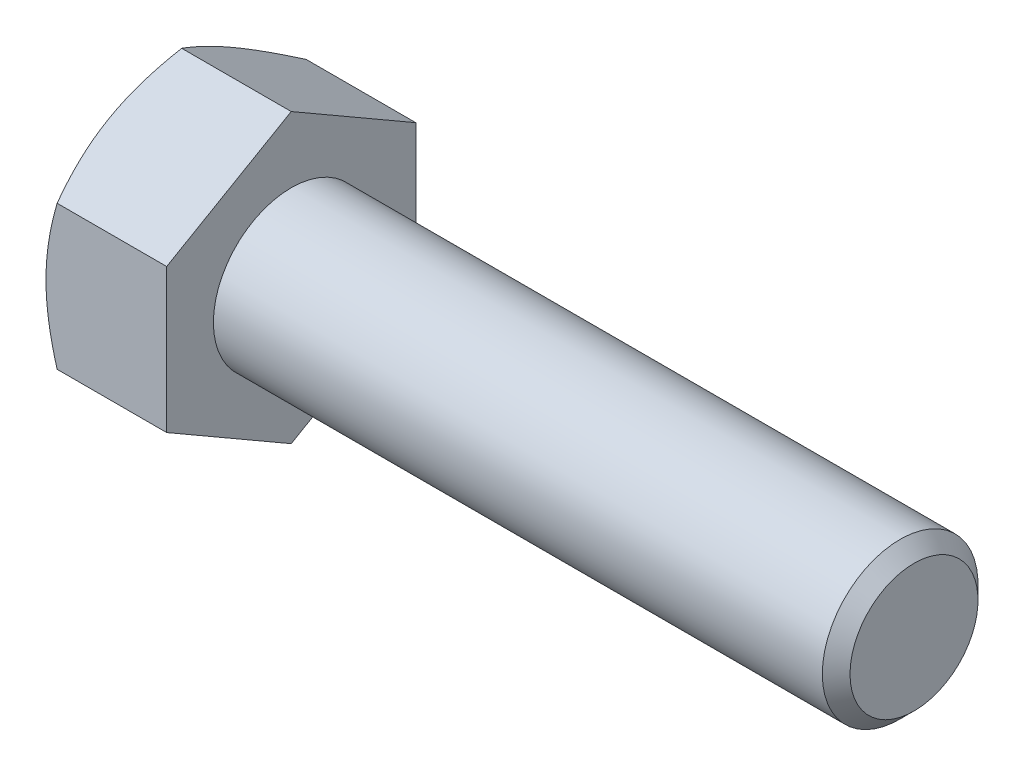
ISO-10303-21;
HEADER;
FILE_DESCRIPTION(('STEP AP214'),'2;1');
FILE_NAME('part.step','',(''),(''),'','','');
FILE_SCHEMA(('AUTOMOTIVE_DESIGN { 1 0 10303 214 1 1 1 1 }'));
ENDSEC;
DATA;
#1=APPLICATION_CONTEXT('core data for automotive mechanical design processes');
#2=APPLICATION_PROTOCOL_DEFINITION('international standard','automotive_design',2000,#1);
#3=PRODUCT_CONTEXT('',#1,'mechanical');
#4=PRODUCT('Part','Part','',(#3));
#5=PRODUCT_RELATED_PRODUCT_CATEGORY('part','',(#4));
#6=PRODUCT_DEFINITION_FORMATION('','',#4);
#7=PRODUCT_DEFINITION_CONTEXT('part definition',#1,'design');
#8=PRODUCT_DEFINITION('design','',#6,#7);
#9=PRODUCT_DEFINITION_SHAPE('','',#8);
#10=(LENGTH_UNIT() NAMED_UNIT(*) SI_UNIT(.MILLI.,.METRE.));
#11=(NAMED_UNIT(*) PLANE_ANGLE_UNIT() SI_UNIT($,.RADIAN.));
#12=(NAMED_UNIT(*) SI_UNIT($,.STERADIAN.) SOLID_ANGLE_UNIT());
#13=UNCERTAINTY_MEASURE_WITH_UNIT(LENGTH_MEASURE(1.E-05),#10,'distance_accuracy_value','');
#14=(GEOMETRIC_REPRESENTATION_CONTEXT(3) GLOBAL_UNCERTAINTY_ASSIGNED_CONTEXT((#13)) GLOBAL_UNIT_ASSIGNED_CONTEXT((#10,
#11,#12)) REPRESENTATION_CONTEXT('',''));
#15=CARTESIAN_POINT('',(0.,0.,0.));
#16=DIRECTION('',(0.,0.,1.));
#17=DIRECTION('',(1.,0.,0.));
#18=AXIS2_PLACEMENT_3D('',#15,#16,#17);
#19=CARTESIAN_POINT('',(3.875,2.3094010767585,-4.));
#20=DIRECTION('',(0.,-0.866025403784438,0.500000000000001));
#21=DIRECTION('',(0.,-0.500000000000001,-0.866025403784438));
#22=AXIS2_PLACEMENT_3D('',#19,#20,#21);
#23=PLANE('',#22);
#24=CARTESIAN_POINT('',(0.357332259074766,4.61891762357085,0.0002));
#25=CARTESIAN_POINT('',(0.298717873648282,4.51743148381381,-0.175579150323228));
#26=CARTESIAN_POINT('',(0.245410321462263,4.41506932144052,-0.35287561632638));
#27=CARTESIAN_POINT('',(0.152361670746404,4.2085725054774,-0.710538593175706));
#28=CARTESIAN_POINT('',(0.112653489029705,4.10443418285647,-0.89091145897015));
#29=CARTESIAN_POINT('',(0.05084221528028,3.89744813015756,-1.24942181870279));
#30=CARTESIAN_POINT('',(0.0283277315228896,3.7946322465506,-1.42750415293514));
#31=CARTESIAN_POINT('',(0.00145062314658241,3.58851671999023,-1.78450671716651));
#32=CARTESIAN_POINT('',(-0.00293425857305617,3.48521782616117,-1.9634256496441));
#33=CARTESIAN_POINT('',(0.0061900729399703,3.29219970504619,-2.29774284219673));
#34=CARTESIAN_POINT('',(0.0174589539879938,3.20245157692487,-2.45319115998706));
#35=CARTESIAN_POINT('',(0.0531739907981921,3.02354002635497,-2.76307505563505));
#36=CARTESIAN_POINT('',(0.0776323457115318,2.93437722268073,-2.91750956174413));
#37=CARTESIAN_POINT('',(0.138776064919287,2.75509682012354,-3.22803232777458));
#38=CARTESIAN_POINT('',(0.175720603654861,2.6650019108942,-3.3840812880631));
#39=CARTESIAN_POINT('',(0.259570072548023,2.486155802,-3.69385183540384));
#40=CARTESIAN_POINT('',(0.306455302212736,2.39740231122585,-3.84757739077378));
#41=CARTESIAN_POINT('',(0.357332259074762,2.30928560670466,-4.0002));
#42=B_SPLINE_CURVE_WITH_KNOTS('',3,(#24,#25,#26,#27,#28,#29,#30,#31,#32,#33,#34,#35,#36,#37,#38,
#39,#40,#41),.UNSPECIFIED.,.F.,.F.,(4,2,2,2,2,2,2,2,4),(0.,0.634047835695966,1.26961969224543,
1.88946157213122,2.50854226669297,3.04757825393386,3.58711366126903,4.13861653143764,
4.68903648037743),.UNSPECIFIED.);
#43=CARTESIAN_POINT('',(0.357265589908162,4.61880215351701,0.));
#44=VERTEX_POINT('',#43);
#45=CARTESIAN_POINT('',(0.,3.46410161513775,-2.));
#46=VERTEX_POINT('',#45);
#47=EDGE_CURVE('E55',#44,#46,#42,.T.);
#48=ORIENTED_EDGE('',*,*,#47,.F.);
#49=DIRECTION('',(-1.,0.,0.));
#50=VECTOR('',#49,1.);
#51=CARTESIAN_POINT('',(3.875,4.61880215351701,0.));
#52=LINE('',#51,#50);
#53=CARTESIAN_POINT('',(3.875,4.61880215351701,0.));
#54=VERTEX_POINT('',#53);
#55=EDGE_CURVE('E151',#54,#44,#52,.T.);
#56=ORIENTED_EDGE('',*,*,#55,.F.);
#57=DIRECTION('',(0.,0.500000000000001,0.866025403784438));
#58=VECTOR('',#57,1.);
#59=CARTESIAN_POINT('',(3.875,2.3094010767585,-4.));
#60=LINE('',#59,#58);
#61=CARTESIAN_POINT('',(3.875,2.3094010767585,-4.));
#62=VERTEX_POINT('',#61);
#63=EDGE_CURVE('E236',#62,#54,#60,.T.);
#64=ORIENTED_EDGE('',*,*,#63,.F.);
#65=DIRECTION('',(-1.,0.,0.));
#66=VECTOR('',#65,1.);
#67=CARTESIAN_POINT('',(3.875,2.3094010767585,-4.));
#68=LINE('',#67,#66);
#69=CARTESIAN_POINT('',(0.357265589908158,2.3094010767585,-4.));
#70=VERTEX_POINT('',#69);
#71=EDGE_CURVE('E139',#62,#70,#68,.T.);
#72=ORIENTED_EDGE('',*,*,#71,.T.);
#73=EDGE_CURVE('E133',#46,#70,#42,.T.);
#74=ORIENTED_EDGE('',*,*,#73,.F.);
#75=EDGE_LOOP('',(#48,#56,#64,#72,#74));
#76=FACE_BOUND('',#75,.T.);
#77=ADVANCED_FACE('F39',(#76),#23,.F.);
#78=CARTESIAN_POINT('',(3.875,4.61880215351701,0.));
#79=DIRECTION('',(0.,-0.866025403784438,-0.500000000000001));
#80=DIRECTION('',(0.,0.500000000000001,-0.866025403784438));
#81=AXIS2_PLACEMENT_3D('',#78,#79,#80);
#82=PLANE('',#81);
#83=CARTESIAN_POINT('',(0.357332259074763,2.30928560670466,4.0002));
#84=CARTESIAN_POINT('',(0.298717873648279,2.4107717464617,3.82442084967677));
#85=CARTESIAN_POINT('',(0.24541032146226,2.51313390883499,3.64712438367362));
#86=CARTESIAN_POINT('',(0.152361670746402,2.71963072479811,3.28946140682429));
#87=CARTESIAN_POINT('',(0.112653489029703,2.82376904741904,3.10908854102985));
#88=CARTESIAN_POINT('',(0.0508422152802788,3.03075510011795,2.75057818129721));
#89=CARTESIAN_POINT('',(0.028327731522889,3.13357098372492,2.57249584706486));
#90=CARTESIAN_POINT('',(0.00145062314658226,3.33968651028528,2.21549328283349));
#91=CARTESIAN_POINT('',(-0.00293425857305652,3.44298540411434,2.0365743503559));
#92=CARTESIAN_POINT('',(0.00619007293997049,3.63600352522932,1.70225715780327));
#93=CARTESIAN_POINT('',(0.0174589539879946,3.72575165335065,1.54680884001294));
#94=CARTESIAN_POINT('',(0.0531739907981937,3.90466320392055,1.23692494436495));
#95=CARTESIAN_POINT('',(0.0776323457115336,3.99382600759479,1.08249043825587));
#96=CARTESIAN_POINT('',(0.138776064919289,4.17310641015197,0.771967672225423));
#97=CARTESIAN_POINT('',(0.175720603654863,4.26320131938131,0.615918711936899));
#98=CARTESIAN_POINT('',(0.259570072548026,4.44204742827551,0.306148164596161));
#99=CARTESIAN_POINT('',(0.306455302212739,4.53080091904967,0.152422609226221));
#100=CARTESIAN_POINT('',(0.357332259074766,4.61891762357085,-0.000199999999999917));
#101=B_SPLINE_CURVE_WITH_KNOTS('',3,(#83,#84,#85,#86,#87,#88,#89,#90,#91,#92,#93,#94,#95,#96,
#97,#98,#99,#100),.UNSPECIFIED.,.F.,.F.,(4,2,2,2,2,2,2,2,4),(0.,0.634047835695965,
1.26961969224543,1.88946157213122,2.50854226669297,3.04757825393385,3.58711366126903,
4.13861653143764,4.68903648037743),.UNSPECIFIED.);
#102=CARTESIAN_POINT('',(0.357265589908158,2.3094010767585,4.));
#103=VERTEX_POINT('',#102);
#104=CARTESIAN_POINT('',(0.,3.46410161513775,2.));
#105=VERTEX_POINT('',#104);
#106=EDGE_CURVE('E62',#103,#105,#101,.T.);
#107=ORIENTED_EDGE('',*,*,#106,.F.);
#108=DIRECTION('',(-1.,0.,0.));
#109=VECTOR('',#108,1.);
#110=CARTESIAN_POINT('',(3.875,2.3094010767585,4.));
#111=LINE('',#110,#109);
#112=CARTESIAN_POINT('',(3.875,2.3094010767585,4.));
#113=VERTEX_POINT('',#112);
#114=EDGE_CURVE('E149',#113,#103,#111,.T.);
#115=ORIENTED_EDGE('',*,*,#114,.F.);
#116=DIRECTION('',(0.,-0.500000000000001,0.866025403784438));
#117=VECTOR('',#116,1.);
#118=CARTESIAN_POINT('',(3.875,4.61880215351701,0.));
#119=LINE('',#118,#117);
#120=EDGE_CURVE('E234',#54,#113,#119,.T.);
#121=ORIENTED_EDGE('',*,*,#120,.F.);
#122=ORIENTED_EDGE('',*,*,#55,.T.);
#123=EDGE_CURVE('E166',#105,#44,#101,.T.);
#124=ORIENTED_EDGE('',*,*,#123,.F.);
#125=EDGE_LOOP('',(#107,#115,#121,#122,#124));
#126=FACE_BOUND('',#125,.T.);
#127=ADVANCED_FACE('F172',(#126),#82,.F.);
#128=CARTESIAN_POINT('',(3.875,2.3094010767585,4.));
#129=DIRECTION('',(0.,0.,-1.));
#130=DIRECTION('',(-1.,0.,0.));
#131=AXIS2_PLACEMENT_3D('',#128,#129,#130);
#132=PLANE('',#131);
#133=CARTESIAN_POINT('',(2.00011120385046,-6.30203842341183,4.));
#134=CARTESIAN_POINT('',(1.91454696302706,-6.12645846502785,4.));
#135=CARTESIAN_POINT('',(1.82977515690346,-5.95048585438817,4.));
#136=CARTESIAN_POINT('',(1.66226027661303,-5.59754684141581,4.));
#137=CARTESIAN_POINT('',(1.57951750403356,-5.42058029609575,4.));
#138=CARTESIAN_POINT('',(1.4161092617051,-5.06457985037648,4.));
#139=CARTESIAN_POINT('',(1.33545672605323,-4.8855399932704,4.));
#140=CARTESIAN_POINT('',(1.17732357965482,-4.52607013031638,4.));
#141=CARTESIAN_POINT('',(1.09984282527701,-4.34564018785784,4.));
#142=CARTESIAN_POINT('',(0.946328317401932,-3.97695712218343,4.));
#143=CARTESIAN_POINT('',(0.870432703669638,-3.78864617451164,4.));
#144=CARTESIAN_POINT('',(0.724150215280467,-3.40985798807121,4.));
#145=CARTESIAN_POINT('',(0.653763944661546,-3.21938051438197,4.));
#146=CARTESIAN_POINT('',(0.520275623047367,-2.83628176991273,4.));
#147=CARTESIAN_POINT('',(0.457159650991073,-2.64366539743606,4.));
#148=CARTESIAN_POINT('',(0.340171517307156,-2.25567134243403,4.));
#149=CARTESIAN_POINT('',(0.286296547451804,-2.06029451838051,4.));
#150=CARTESIAN_POINT('',(0.190596079734457,-1.66775019550379,4.));
#151=CARTESIAN_POINT('',(0.148703055513722,-1.4705994608802,4.));
#152=CARTESIAN_POINT('',(0.0792701946386919,-1.07374632394227,4.));
#153=CARTESIAN_POINT('',(0.0517287926791975,-0.874044202338206,4.));
#154=CARTESIAN_POINT('',(0.0135517370726279,-0.475733693101286,4.));
#155=CARTESIAN_POINT('',(0.00269106574828969,-0.277147419592185,4.));
#156=CARTESIAN_POINT('',(-0.00180277188208267,0.120241435280096,4.));
#157=CARTESIAN_POINT('',(0.00456430925773771,0.3190440197092,4.));
#158=CARTESIAN_POINT('',(0.0293199840216136,0.653649130511195,4.));
#159=CARTESIAN_POINT('',(0.0433487693682717,0.789796203877397,4.));
#160=CARTESIAN_POINT('',(0.0786650583146093,1.06115179654902,4.));
#161=CARTESIAN_POINT('',(0.0999534649347829,1.19636019695747,4.));
#162=CARTESIAN_POINT('',(0.173595112588807,1.60036108675971,4.));
#163=CARTESIAN_POINT('',(0.235713609104602,1.86739657992387,4.));
#164=CARTESIAN_POINT('',(0.344187906710575,2.26690842076046,4.));
#165=CARTESIAN_POINT('',(0.383434483337921,2.40143348236976,4.));
#166=CARTESIAN_POINT('',(0.466191101497678,2.66917849144139,4.));
#167=CARTESIAN_POINT('',(0.509701176020062,2.8023984287962,4.));
#168=CARTESIAN_POINT('',(0.600271093153284,3.06757339019427,4.));
#169=CARTESIAN_POINT('',(0.647329942526204,3.1995287566004,4.));
#170=CARTESIAN_POINT('',(0.744425095187852,3.46233233841869,4.));
#171=CARTESIAN_POINT('',(0.79446132942051,3.59318057942867,4.));
#172=CARTESIAN_POINT('',(0.933355738336687,3.94627302000953,4.));
#173=CARTESIAN_POINT('',(1.02459875944488,4.16757823468636,4.));
#174=CARTESIAN_POINT('',(1.21247228327858,4.6078984954445,4.));
#175=CARTESIAN_POINT('',(1.30910339202328,4.82691328060904,4.));
#176=CARTESIAN_POINT('',(1.50647026541792,5.26317250155479,4.));
#177=CARTESIAN_POINT('',(1.60720746834516,5.48041628445574,4.));
#178=CARTESIAN_POINT('',(1.81181128465854,5.91342831583172,4.));
#179=CARTESIAN_POINT('',(1.91567799508361,6.12919651829727,4.));
#180=CARTESIAN_POINT('',(2.12601768874589,6.5598802172624,4.));
#181=CARTESIAN_POINT('',(2.23249454398486,6.77479381881756,4.));
#182=CARTESIAN_POINT('',(2.44739203587053,7.20364802853136,4.));
#183=CARTESIAN_POINT('',(2.55581269331614,7.417588626248,4.));
#184=CARTESIAN_POINT('',(2.88334503455633,8.05812603320375,4.));
#185=CARTESIAN_POINT('',(3.1047754932341,8.48353660300325,4.));
#186=CARTESIAN_POINT('',(3.52798949335261,9.28704830216623,4.));
#187=CARTESIAN_POINT('',(3.72935795048664,9.66536912757715,4.));
#188=CARTESIAN_POINT('',(4.13451859162102,10.4207405569166,4.));
#189=CARTESIAN_POINT('',(4.33831092670877,10.7977910797637,4.));
#190=CARTESIAN_POINT('',(4.74699525515909,11.5496417866802,4.));
#191=CARTESIAN_POINT('',(4.95188119224404,11.9244452679585,4.));
#192=CARTESIAN_POINT('',(5.36302659523091,12.673259459655,4.));
#193=CARTESIAN_POINT('',(5.56928595009503,13.0472702310149,4.));
#194=CARTESIAN_POINT('',(5.77604503303503,13.4210028084018,4.));
#195=B_SPLINE_CURVE_WITH_KNOTS('',3,(#133,#134,#135,#136,#137,#138,#139,#140,#141,#142,#143,
#144,#145,#146,#147,#148,#149,#150,#151,#152,#153,#154,#155,#156,#157,#158,#159,#160,#161,#162,
#163,#164,#165,#166,#167,#168,#169,#170,#171,#172,#173,#174,#175,#176,#177,#178,#179,#180,#181,
#182,#183,#184,#185,#186,#187,#188,#189,#190,#191,#192,#193,#194),.UNSPECIFIED.,.F.,.F.,(4,2,2,
2,2,2,2,2,2,2,2,2,2,2,2,2,2,2,2,2,2,2,2,2,2,2,2,2,2,2,4),(0.,0.585964079589229,1.1720147329867,
1.76109183439221,2.35014223039207,2.95916537113302,3.56825519120251,4.17615863495933,
4.78387701573011,5.38809978568041,5.99225664035711,6.58818972380393,7.18413136680919,
7.59453802315343,8.00499574839967,8.82630883348707,9.24666973074845,9.66703388092335,
10.0872808123363,10.5075180005349,11.2255416622244,11.9436462463738,12.6620045660407,
13.3803851833438,14.0999050636407,14.8194326474842,16.2581595478086,17.5438734370163,
18.8296678929704,20.1111105384062,21.3924508103747),.UNSPECIFIED.);
#196=CARTESIAN_POINT('',(0.35726558990816,-2.30940107675851,4.));
#197=VERTEX_POINT('',#196);
#198=CARTESIAN_POINT('',(0.,0.,4.));
#199=VERTEX_POINT('',#198);
#200=EDGE_CURVE('E246',#197,#199,#195,.T.);
#201=ORIENTED_EDGE('',*,*,#200,.F.);
#202=DIRECTION('',(-1.,0.,0.));
#203=VECTOR('',#202,1.);
#204=CARTESIAN_POINT('',(3.875,-2.30940107675851,4.));
#205=LINE('',#204,#203);
#206=CARTESIAN_POINT('',(3.875,-2.30940107675851,4.));
#207=VERTEX_POINT('',#206);
#208=EDGE_CURVE('E141',#207,#197,#205,.T.);
#209=ORIENTED_EDGE('',*,*,#208,.F.);
#210=DIRECTION('',(0.,-1.,0.));
#211=VECTOR('',#210,1.);
#212=CARTESIAN_POINT('',(3.875,2.3094010767585,4.));
#213=LINE('',#212,#211);
#214=EDGE_CURVE('E230',#113,#207,#213,.T.);
#215=ORIENTED_EDGE('',*,*,#214,.F.);
#216=ORIENTED_EDGE('',*,*,#114,.T.);
#217=EDGE_CURVE('E188',#199,#103,#195,.T.);
#218=ORIENTED_EDGE('',*,*,#217,.F.);
#219=EDGE_LOOP('',(#201,#209,#215,#216,#218));
#220=FACE_BOUND('',#219,.T.);
#221=ADVANCED_FACE('F252',(#220),#132,.F.);
#222=CARTESIAN_POINT('',(3.875,-4.61880215351702,0.));
#223=DIRECTION('',(0.,0.866025403784438,-0.500000000000001));
#224=DIRECTION('',(0.,0.500000000000001,0.866025403784438));
#225=AXIS2_PLACEMENT_3D('',#222,#223,#224);
#226=PLANE('',#225);
#227=CARTESIAN_POINT('',(0.357332259074769,-4.61891762357086,-0.000199999999999656));
#228=CARTESIAN_POINT('',(0.298717873648285,-4.51743148381382,0.175579150323229));
#229=CARTESIAN_POINT('',(0.245410321462266,-4.41506932144053,0.352875616326382));
#230=CARTESIAN_POINT('',(0.152361670746407,-4.2085725054774,0.710538593175707));
#231=CARTESIAN_POINT('',(0.112653489029708,-4.10443418285648,0.890911458970152));
#232=CARTESIAN_POINT('',(0.0508422152802828,-3.89744813015757,1.24942181870279));
#233=CARTESIAN_POINT('',(0.0283277315228926,-3.7946322465506,1.42750415293514));
#234=CARTESIAN_POINT('',(0.00145062314658542,-3.58851671999023,1.78450671716651));
#235=CARTESIAN_POINT('',(-0.00293425857305338,-3.48521782616118,1.9634256496441));
#236=CARTESIAN_POINT('',(0.00619007293997324,-3.29219970504619,2.29774284219673));
#237=CARTESIAN_POINT('',(0.017458953987997,-3.20245157692487,2.45319115998707));
#238=CARTESIAN_POINT('',(0.0531739907981951,-3.02354002635497,2.76307505563506));
#239=CARTESIAN_POINT('',(0.0776323457115345,-2.93437722268073,2.91750956174413));
#240=CARTESIAN_POINT('',(0.13877606491929,-2.75509682012355,3.22803232777458));
#241=CARTESIAN_POINT('',(0.175720603654863,-2.6650019108942,3.3840812880631));
#242=CARTESIAN_POINT('',(0.259570072548026,-2.48615580200001,3.69385183540384));
#243=CARTESIAN_POINT('',(0.306455302212738,-2.39740231122585,3.84757739077378));
#244=CARTESIAN_POINT('',(0.357332259074764,-2.30928560670467,4.0002));
#245=B_SPLINE_CURVE_WITH_KNOTS('',3,(#227,#228,#229,#230,#231,#232,#233,#234,#235,#236,#237,
#238,#239,#240,#241,#242,#243,#244),.UNSPECIFIED.,.F.,.F.,(4,2,2,2,2,2,2,2,4),(0.,
0.634047835695967,1.26961969224543,1.88946157213122,2.50854226669297,3.04757825393386,
3.58711366126904,4.13861653143764,4.68903648037743),.UNSPECIFIED.);
#246=CARTESIAN_POINT('',(0.357265589908165,-4.61880215351702,0.));
#247=VERTEX_POINT('',#246);
#248=CARTESIAN_POINT('',(0.,-3.46410161513775,2.));
#249=VERTEX_POINT('',#248);
#250=EDGE_CURVE('E174',#247,#249,#245,.T.);
#251=ORIENTED_EDGE('',*,*,#250,.F.);
#252=DIRECTION('',(-1.,0.,0.));
#253=VECTOR('',#252,1.);
#254=CARTESIAN_POINT('',(3.875,-4.61880215351702,0.));
#255=LINE('',#254,#253);
#256=CARTESIAN_POINT('',(3.875,-4.61880215351702,0.));
#257=VERTEX_POINT('',#256);
#258=EDGE_CURVE('E138',#257,#247,#255,.T.);
#259=ORIENTED_EDGE('',*,*,#258,.F.);
#260=DIRECTION('',(0.,-0.500000000000001,-0.866025403784438));
#261=VECTOR('',#260,1.);
#262=CARTESIAN_POINT('',(3.875,-4.61880215351702,0.));
#263=LINE('',#262,#261);
#264=EDGE_CURVE('E228',#207,#257,#263,.T.);
#265=ORIENTED_EDGE('',*,*,#264,.F.);
#266=ORIENTED_EDGE('',*,*,#208,.T.);
#267=EDGE_CURVE('E176',#249,#197,#245,.T.);
#268=ORIENTED_EDGE('',*,*,#267,.F.);
#269=EDGE_LOOP('',(#251,#259,#265,#266,#268));
#270=FACE_BOUND('',#269,.T.);
#271=ADVANCED_FACE('F224',(#270),#226,.F.);
#272=CARTESIAN_POINT('',(3.875,-2.30940107675851,-4.));
#273=DIRECTION('',(0.,0.866025403784438,0.500000000000001));
#274=DIRECTION('',(0.,-0.500000000000001,0.866025403784438));
#275=AXIS2_PLACEMENT_3D('',#272,#273,#274);
#276=PLANE('',#275);
#277=CARTESIAN_POINT('',(0.357332259074765,-2.30928560670467,-4.0002));
#278=CARTESIAN_POINT('',(0.298717873648281,-2.41077174646171,-3.82442084967677));
#279=CARTESIAN_POINT('',(0.245410321462262,-2.513133908835,-3.64712438367362));
#280=CARTESIAN_POINT('',(0.152361670746404,-2.71963072479812,-3.28946140682429));
#281=CARTESIAN_POINT('',(0.112653489029705,-2.82376904741905,-3.10908854102985));
#282=CARTESIAN_POINT('',(0.0508422152802814,-3.03075510011796,-2.75057818129721));
#283=CARTESIAN_POINT('',(0.0283277315228918,-3.13357098372492,-2.57249584706486));
#284=CARTESIAN_POINT('',(0.00145062314658541,-3.33968651028529,-2.21549328283349));
#285=CARTESIAN_POINT('',(-0.00293425857305316,-3.44298540411435,-2.0365743503559));
#286=CARTESIAN_POINT('',(0.006190072939974,-3.63600352522933,-1.70225715780327));
#287=CARTESIAN_POINT('',(0.0174589539879981,-3.72575165335065,-1.54680884001294));
#288=CARTESIAN_POINT('',(0.053173990798197,-3.90466320392055,-1.23692494436495));
#289=CARTESIAN_POINT('',(0.0776323457115368,-3.99382600759479,-1.08249043825587));
#290=CARTESIAN_POINT('',(0.138776064919293,-4.17310641015198,-0.771967672225423));
#291=CARTESIAN_POINT('',(0.175720603654867,-4.26320131938132,-0.615918711936898));
#292=CARTESIAN_POINT('',(0.25957007254803,-4.44204742827551,-0.306148164596161));
#293=CARTESIAN_POINT('',(0.306455302212742,-4.53080091904967,-0.152422609226221));
#294=CARTESIAN_POINT('',(0.357332259074769,-4.61891762357086,0.000200000000000066));
#295=B_SPLINE_CURVE_WITH_KNOTS('',3,(#277,#278,#279,#280,#281,#282,#283,#284,#285,#286,#287,
#288,#289,#290,#291,#292,#293,#294),.UNSPECIFIED.,.F.,.F.,(4,2,2,2,2,2,2,2,4),(0.,
0.634047835695965,1.26961969224543,1.88946157213122,2.50854226669297,3.04757825393386,
3.58711366126903,4.13861653143764,4.68903648037743),.UNSPECIFIED.);
#296=CARTESIAN_POINT('',(0.357265589908043,-2.30940107675869,-4.));
#297=VERTEX_POINT('',#296);
#298=CARTESIAN_POINT('',(0.,-3.46410161513775,-2.));
#299=VERTEX_POINT('',#298);
#300=EDGE_CURVE('E115',#297,#299,#295,.T.);
#301=ORIENTED_EDGE('',*,*,#300,.F.);
#302=DIRECTION('',(-1.,0.,0.));
#303=VECTOR('',#302,1.);
#304=CARTESIAN_POINT('',(3.875,-2.30940107675851,-4.));
#305=LINE('',#304,#303);
#306=CARTESIAN_POINT('',(3.875,-2.30940107675851,-4.));
#307=VERTEX_POINT('',#306);
#308=EDGE_CURVE('E129',#307,#297,#305,.T.);
#309=ORIENTED_EDGE('',*,*,#308,.F.);
#310=DIRECTION('',(0.,0.500000000000001,-0.866025403784438));
#311=VECTOR('',#310,1.);
#312=CARTESIAN_POINT('',(3.875,-2.30940107675851,-4.));
#313=LINE('',#312,#311);
#314=EDGE_CURVE('E226',#257,#307,#313,.T.);
#315=ORIENTED_EDGE('',*,*,#314,.F.);
#316=ORIENTED_EDGE('',*,*,#258,.T.);
#317=EDGE_CURVE('E132',#299,#247,#295,.T.);
#318=ORIENTED_EDGE('',*,*,#317,.F.);
#319=EDGE_LOOP('',(#301,#309,#315,#316,#318));
#320=FACE_BOUND('',#319,.T.);
#321=ADVANCED_FACE('F127',(#320),#276,.F.);
#322=CARTESIAN_POINT('',(3.875,2.3094010767585,-4.));
#323=DIRECTION('',(0.,0.,1.));
#324=DIRECTION('',(0.,-1.,0.));
#325=AXIS2_PLACEMENT_3D('',#322,#323,#324);
#326=PLANE('',#325);
#327=CARTESIAN_POINT('',(2.00011120589741,-6.30203842761113,-4.));
#328=CARTESIAN_POINT('',(1.91454696498874,-6.12645846908575,-4.));
#329=CARTESIAN_POINT('',(1.82977515877991,-5.95048585830456,-4.));
#330=CARTESIAN_POINT('',(1.66226027831944,-5.59754684504877,-4.));
#331=CARTESIAN_POINT('',(1.57951750565516,-5.42058029958678,-4.));
#332=CARTESIAN_POINT('',(1.41610926315703,-5.06457985358152,-4.));
#333=CARTESIAN_POINT('',(1.33545672742031,-4.88553999633137,-4.));
#334=CARTESIAN_POINT('',(1.17732358085362,-4.52607013308825,-4.));
#335=CARTESIAN_POINT('',(1.09984282639236,-4.34564019048468,-4.));
#336=CARTESIAN_POINT('',(0.946328318347809,-3.97695712450867,-4.));
#337=CARTESIAN_POINT('',(0.870432704529684,-3.78864617668021,-4.));
#338=CARTESIAN_POINT('',(0.724150215973384,-3.40985798992395,-4.));
#339=CARTESIAN_POINT('',(0.653763945273167,-3.21938051607555,-4.));
#340=CARTESIAN_POINT('',(0.520275623504079,-2.83628177128505,-4.));
#341=CARTESIAN_POINT('',(0.457159651374151,-2.64366539864628,-4.));
#342=CARTESIAN_POINT('',(0.340171517554839,-2.25567134331569,-4.));
#343=CARTESIAN_POINT('',(0.286296547637718,-2.0602945190957,-4.));
#344=CARTESIAN_POINT('',(0.190596079795568,-1.66775019580152,-4.));
#345=CARTESIAN_POINT('',(0.148703055516465,-1.47059946092579,-4.));
#346=CARTESIAN_POINT('',(0.0792701945625816,-1.0737463234774,-4.));
#347=CARTESIAN_POINT('',(0.0517287925825739,-0.874044201615014,-4.));
#348=CARTESIAN_POINT('',(0.0135517369810985,-0.475733691865667,-4.));
#349=CARTESIAN_POINT('',(0.00269106568150367,-0.277147418102514,-4.));
#350=CARTESIAN_POINT('',(-0.0018027718547366,0.120241437274119,-4.));
#351=CARTESIAN_POINT('',(0.00456430935448299,0.319044021953522,-4.));
#352=CARTESIAN_POINT('',(0.0293199842587319,0.653649133068289,-4.));
#353=CARTESIAN_POINT('',(0.0433487696608963,0.789796206499806,-4.));
#354=CARTESIAN_POINT('',(0.0786650587211739,1.06115179929909,-4.));
#355=CARTESIAN_POINT('',(0.0999534653997816,1.19636019976989,-4.));
#356=CARTESIAN_POINT('',(0.173595113230303,1.6003610897557,-4.));
#357=CARTESIAN_POINT('',(0.235713609865278,1.86739658303732,-4.));
#358=CARTESIAN_POINT('',(0.344187907647021,2.26690842404958,-4.));
#359=CARTESIAN_POINT('',(0.383434484333357,2.40143348571873,-4.));
#360=CARTESIAN_POINT('',(0.466191102609246,2.66917849490936,-4.));
#361=CARTESIAN_POINT('',(0.509701177188773,2.80239843232331,-4.));
#362=CARTESIAN_POINT('',(0.600271094434186,3.06757339383922,-4.));
#363=CARTESIAN_POINT('',(0.64732994386215,3.19952876030405,-4.));
#364=CARTESIAN_POINT('',(0.744425096631931,3.46233234223974,-4.));
#365=CARTESIAN_POINT('',(0.794461330917676,3.59318058330842,-4.));
#366=CARTESIAN_POINT('',(0.933355739925497,3.94627302392212,-4.));
#367=CARTESIAN_POINT('',(1.0245987610664,4.16757823857486,-4.));
#368=CARTESIAN_POINT('',(1.21247228495599,4.60789849928792,-4.));
#369=CARTESIAN_POINT('',(1.30910339372387,4.8269132844315,-4.));
#370=CARTESIAN_POINT('',(1.50647026715798,5.26317250533757,-4.));
#371=CARTESIAN_POINT('',(1.60720747010151,5.48041628821981,-4.));
#372=CARTESIAN_POINT('',(1.81181128644256,5.91342831956035,-4.));
#373=CARTESIAN_POINT('',(1.91567799687904,6.12919652200917,-4.));
#374=CARTESIAN_POINT('',(2.12601769056008,6.55988022094135,-4.));
#375=CARTESIAN_POINT('',(2.23249454580638,6.77479382248029,-4.));
#376=CARTESIAN_POINT('',(2.44739203770407,7.20364803216286,-4.));
#377=CARTESIAN_POINT('',(2.55581269515435,7.41758862986449,-4.));
#378=CARTESIAN_POINT('',(2.88334503640576,8.05812603677698,-4.));
#379=CARTESIAN_POINT('',(3.10477549508711,8.48353660654961,-4.));
#380=CARTESIAN_POINT('',(3.52798949521966,9.287048305686,-4.));
#381=CARTESIAN_POINT('',(3.7293579523648,9.66536913109687,-4.));
#382=CARTESIAN_POINT('',(4.13451859351913,10.4207405604373,-4.));
#383=CARTESIAN_POINT('',(4.33831092861572,10.7977910832854,-4.));
#384=CARTESIAN_POINT('',(4.74699525708426,11.5496417902084,-4.));
#385=CARTESIAN_POINT('',(4.9518811941786,11.9244452714923,-4.));
#386=CARTESIAN_POINT('',(5.36302659718324,12.6732594632006,-4.));
#387=CARTESIAN_POINT('',(5.56928595205573,13.0472702345667,-4.));
#388=CARTESIAN_POINT('',(5.77604503500377,13.42100281196,-4.));
#389=B_SPLINE_CURVE_WITH_KNOTS('',3,(#327,#328,#329,#330,#331,#332,#333,#334,#335,#336,#337,
#338,#339,#340,#341,#342,#343,#344,#345,#346,#347,#348,#349,#350,#351,#352,#353,#354,#355,#356,
#357,#358,#359,#360,#361,#362,#363,#364,#365,#366,#367,#368,#369,#370,#371,#372,#373,#374,#375,
#376,#377,#378,#379,#380,#381,#382,#383,#384,#385,#386,#387,#388),.UNSPECIFIED.,.F.,.F.,(4,2,2,
2,2,2,2,2,2,2,2,2,2,2,2,2,2,2,2,2,2,2,2,2,2,2,2,2,2,2,4),(0.,0.585964080082646,1.17201473397361,
1.76109183587772,2.35014223237614,2.95916537364923,3.56825519425103,4.17615863853846,
4.78387701983943,5.38809979056439,5.99225664601462,6.58818973021546,7.18413137397509,
7.59453803053127,8.00499575598947,8.82630884150174,9.24666973898511,9.667033889382,
10.0872808210163,10.5075180094363,11.2255416710968,11.9436462552169,12.6620045748536,
13.3803851921263,14.0999050723894,14.8194326561991,16.2581595564571,17.5438734456804,
18.8296679016496,20.1111105471137,21.3924508191106),.UNSPECIFIED.);
#390=CARTESIAN_POINT('',(0.,0.,-4.));
#391=VERTEX_POINT('',#390);
#392=EDGE_CURVE('E121',#70,#391,#389,.F.);
#393=ORIENTED_EDGE('',*,*,#392,.F.);
#394=ORIENTED_EDGE('',*,*,#71,.F.);
#395=DIRECTION('',(0.,1.,0.));
#396=VECTOR('',#395,1.);
#397=CARTESIAN_POINT('',(3.875,2.3094010767585,-4.));
#398=LINE('',#397,#396);
#399=EDGE_CURVE('E137',#307,#62,#398,.T.);
#400=ORIENTED_EDGE('',*,*,#399,.F.);
#401=ORIENTED_EDGE('',*,*,#308,.T.);
#402=EDGE_CURVE('E112',#391,#297,#389,.F.);
#403=ORIENTED_EDGE('',*,*,#402,.F.);
#404=EDGE_LOOP('',(#393,#394,#400,#401,#403));
#405=FACE_BOUND('',#404,.T.);
#406=ADVANCED_FACE('F135',(#405),#326,.F.);
#407=CARTESIAN_POINT('',(3.875,4.61880215351701,0.));
#408=DIRECTION('',(1.,0.,0.));
#409=DIRECTION('',(0.,0.,-1.));
#410=AXIS2_PLACEMENT_3D('',#407,#408,#409);
#411=PLANE('',#410);
#412=ORIENTED_EDGE('',*,*,#63,.T.);
#413=ORIENTED_EDGE('',*,*,#120,.T.);
#414=ORIENTED_EDGE('',*,*,#214,.T.);
#415=ORIENTED_EDGE('',*,*,#264,.T.);
#416=ORIENTED_EDGE('',*,*,#314,.T.);
#417=ORIENTED_EDGE('',*,*,#399,.T.);
#418=EDGE_LOOP('',(#412,#413,#414,#415,#416,#417));
#419=FACE_BOUND('',#418,.T.);
#420=CARTESIAN_POINT('',(3.875,0.,0.));
#421=DIRECTION('',(1.,0.,0.));
#422=DIRECTION('',(0.,0.,-1.));
#423=AXIS2_PLACEMENT_3D('',#420,#421,#422);
#424=CIRCLE('',#423,2.5);
#425=CARTESIAN_POINT('',(3.875,0.,-2.5));
#426=VERTEX_POINT('',#425);
#427=EDGE_CURVE('E239',#426,#426,#424,.F.);
#428=ORIENTED_EDGE('',*,*,#427,.T.);
#429=EDGE_LOOP('',(#428));
#430=FACE_BOUND('',#429,.T.);
#431=ADVANCED_FACE('F254',(#419,#430),#411,.T.);
#432=CARTESIAN_POINT('',(0.,0.,0.));
#433=DIRECTION('',(-1.,0.,0.));
#434=DIRECTION('',(0.,0.,1.));
#435=AXIS2_PLACEMENT_3D('',#432,#433,#434);
#436=CYLINDRICAL_SURFACE('',#435,2.5);
#437=ORIENTED_EDGE('',*,*,#427,.F.);
#438=EDGE_LOOP('',(#437));
#439=FACE_BOUND('',#438,.T.);
#440=CARTESIAN_POINT('',(23.43,0.,0.));
#441=DIRECTION('',(-1.,0.,0.));
#442=DIRECTION('',(0.,0.,1.));
#443=AXIS2_PLACEMENT_3D('',#440,#441,#442);
#444=CIRCLE('',#443,2.5);
#445=CARTESIAN_POINT('',(23.43,0.,2.5));
#446=VERTEX_POINT('',#445);
#447=EDGE_CURVE('E242',#446,#446,#444,.T.);
#448=ORIENTED_EDGE('',*,*,#447,.T.);
#449=EDGE_LOOP('',(#448));
#450=FACE_BOUND('',#449,.T.);
#451=ADVANCED_FACE('F286',(#439,#450),#436,.T.);
#452=CARTESIAN_POINT('',(23.875,0.,0.));
#453=DIRECTION('',(-1.,0.,0.));
#454=DIRECTION('',(0.,0.,1.));
#455=AXIS2_PLACEMENT_3D('',#452,#453,#454);
#456=CONICAL_SURFACE('',#455,2.055,0.785398163397456);
#457=ORIENTED_EDGE('',*,*,#447,.F.);
#458=EDGE_LOOP('',(#457));
#459=FACE_BOUND('',#458,.T.);
#460=CARTESIAN_POINT('',(23.875,0.,0.));
#461=DIRECTION('',(-1.,0.,0.));
#462=DIRECTION('',(0.,0.,1.));
#463=AXIS2_PLACEMENT_3D('',#460,#461,#462);
#464=CIRCLE('',#463,2.055);
#465=CARTESIAN_POINT('',(23.875,0.,2.055));
#466=VERTEX_POINT('',#465);
#467=EDGE_CURVE('E244',#466,#466,#464,.T.);
#468=ORIENTED_EDGE('',*,*,#467,.T.);
#469=EDGE_LOOP('',(#468));
#470=FACE_BOUND('',#469,.T.);
#471=ADVANCED_FACE('F288',(#459,#470),#456,.T.);
#472=CARTESIAN_POINT('',(23.875,0.,0.));
#473=DIRECTION('',(-1.,0.,0.));
#474=DIRECTION('',(0.,0.,1.));
#475=AXIS2_PLACEMENT_3D('',#472,#473,#474);
#476=PLANE('',#475);
#477=ORIENTED_EDGE('',*,*,#467,.F.);
#478=EDGE_LOOP('',(#477));
#479=FACE_BOUND('',#478,.T.);
#480=ADVANCED_FACE('F201',(#479),#476,.F.);
#481=CARTESIAN_POINT('',(0.,0.,0.));
#482=DIRECTION('',(1.,0.,0.));
#483=DIRECTION('',(0.,0.,-1.));
#484=AXIS2_PLACEMENT_3D('',#481,#482,#483);
#485=CONICAL_SURFACE('',#484,4.,1.0471975511966);
#486=ORIENTED_EDGE('',*,*,#300,.T.);
#487=CARTESIAN_POINT('',(0.,0.,0.));
#488=DIRECTION('',(1.,0.,0.));
#489=DIRECTION('',(0.,0.,-1.));
#490=AXIS2_PLACEMENT_3D('',#487,#488,#489);
#491=CIRCLE('',#490,4.);
#492=EDGE_CURVE('E43',#299,#391,#491,.T.);
#493=ORIENTED_EDGE('',*,*,#492,.T.);
#494=ORIENTED_EDGE('',*,*,#402,.T.);
#495=EDGE_LOOP('',(#486,#493,#494));
#496=FACE_BOUND('',#495,.T.);
#497=ADVANCED_FACE('F114',(#496),#485,.T.);
#498=ORIENTED_EDGE('',*,*,#250,.T.);
#499=EDGE_CURVE('E156',#249,#299,#491,.T.);
#500=ORIENTED_EDGE('',*,*,#499,.T.);
#501=ORIENTED_EDGE('',*,*,#317,.T.);
#502=EDGE_LOOP('',(#498,#500,#501));
#503=FACE_BOUND('',#502,.T.);
#504=ADVANCED_FACE('F200',(#503),#485,.T.);
#505=ORIENTED_EDGE('',*,*,#200,.T.);
#506=EDGE_CURVE('E157',#199,#249,#491,.T.);
#507=ORIENTED_EDGE('',*,*,#506,.T.);
#508=ORIENTED_EDGE('',*,*,#267,.T.);
#509=EDGE_LOOP('',(#505,#507,#508));
#510=FACE_BOUND('',#509,.T.);
#511=ADVANCED_FACE('F195',(#510),#485,.T.);
#512=ORIENTED_EDGE('',*,*,#217,.T.);
#513=ORIENTED_EDGE('',*,*,#106,.T.);
#514=CARTESIAN_POINT('',(0.,0.,0.));
#515=DIRECTION('',(-1.,0.,0.));
#516=DIRECTION('',(0.,0.,1.));
#517=AXIS2_PLACEMENT_3D('',#514,#515,#516);
#518=CIRCLE('',#517,4.);
#519=EDGE_CURVE('E122',#199,#105,#518,.T.);
#520=ORIENTED_EDGE('',*,*,#519,.F.);
#521=EDGE_LOOP('',(#512,#513,#520));
#522=FACE_BOUND('',#521,.T.);
#523=ADVANCED_FACE('F199',(#522),#485,.T.);
#524=ORIENTED_EDGE('',*,*,#123,.T.);
#525=ORIENTED_EDGE('',*,*,#47,.T.);
#526=EDGE_CURVE('E48',#46,#105,#491,.T.);
#527=ORIENTED_EDGE('',*,*,#526,.T.);
#528=EDGE_LOOP('',(#524,#525,#527));
#529=FACE_BOUND('',#528,.T.);
#530=ADVANCED_FACE('F165',(#529),#485,.T.);
#531=ORIENTED_EDGE('',*,*,#73,.T.);
#532=ORIENTED_EDGE('',*,*,#392,.T.);
#533=EDGE_CURVE('E11',#391,#46,#491,.T.);
#534=ORIENTED_EDGE('',*,*,#533,.T.);
#535=EDGE_LOOP('',(#531,#532,#534));
#536=FACE_BOUND('',#535,.T.);
#537=ADVANCED_FACE('F258',(#536),#485,.T.);
#538=CARTESIAN_POINT('',(0.,4.61880215351701,0.));
#539=DIRECTION('',(1.,0.,0.));
#540=DIRECTION('',(0.,0.,-1.));
#541=AXIS2_PLACEMENT_3D('',#538,#539,#540);
#542=PLANE('',#541);
#543=ORIENTED_EDGE('',*,*,#533,.F.);
#544=ORIENTED_EDGE('',*,*,#492,.F.);
#545=ORIENTED_EDGE('',*,*,#499,.F.);
#546=ORIENTED_EDGE('',*,*,#506,.F.);
#547=ORIENTED_EDGE('',*,*,#519,.T.);
#548=ORIENTED_EDGE('',*,*,#526,.F.);
#549=EDGE_LOOP('',(#543,#544,#545,#546,#547,#548));
#550=FACE_BOUND('',#549,.T.);
#551=ADVANCED_FACE('F169',(#550),#542,.F.);
#552=CLOSED_SHELL('',(#77,#127,#221,#271,#321,#406,#431,#451,#471,#480,#497,#504,#511,#523,#530,
#537,#551));
#553=MANIFOLD_SOLID_BREP('B2',#552);
#554=ADVANCED_BREP_SHAPE_REPRESENTATION('',(#18,#553),#14);
#555=SHAPE_DEFINITION_REPRESENTATION(#9,#554);
ENDSEC;
END-ISO-10303-21;
